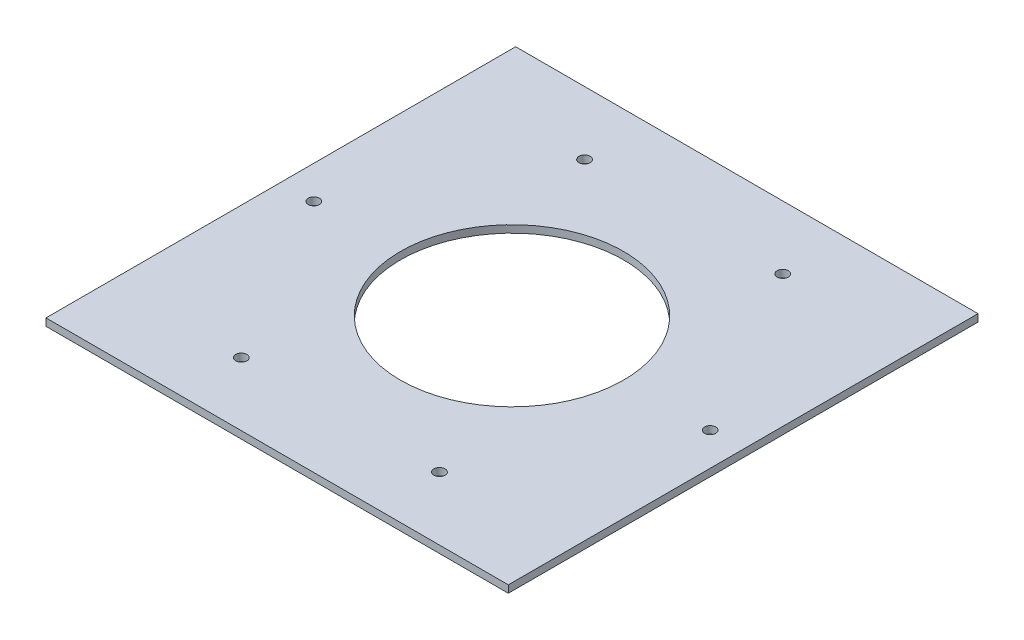
ISO-10303-21;
HEADER;
FILE_DESCRIPTION(('STEP AP214'),'2;1');
FILE_NAME('part.step','',(''),(''),'','','');
FILE_SCHEMA(('AUTOMOTIVE_DESIGN { 1 0 10303 214 1 1 1 1 }'));
ENDSEC;
DATA;
#1=APPLICATION_CONTEXT('core data for automotive mechanical design processes');
#2=APPLICATION_PROTOCOL_DEFINITION('international standard','automotive_design',2000,#1);
#3=PRODUCT_CONTEXT('',#1,'mechanical');
#4=PRODUCT('Part','Part','',(#3));
#5=PRODUCT_RELATED_PRODUCT_CATEGORY('part','',(#4));
#6=PRODUCT_DEFINITION_FORMATION('','',#4);
#7=PRODUCT_DEFINITION_CONTEXT('part definition',#1,'design');
#8=PRODUCT_DEFINITION('design','',#6,#7);
#9=PRODUCT_DEFINITION_SHAPE('','',#8);
#10=(LENGTH_UNIT() NAMED_UNIT(*) SI_UNIT(.MILLI.,.METRE.));
#11=(NAMED_UNIT(*) PLANE_ANGLE_UNIT() SI_UNIT($,.RADIAN.));
#12=(NAMED_UNIT(*) SI_UNIT($,.STERADIAN.) SOLID_ANGLE_UNIT());
#13=UNCERTAINTY_MEASURE_WITH_UNIT(LENGTH_MEASURE(1.E-05),#10,'distance_accuracy_value','');
#14=(GEOMETRIC_REPRESENTATION_CONTEXT(3) GLOBAL_UNCERTAINTY_ASSIGNED_CONTEXT((#13)) GLOBAL_UNIT_ASSIGNED_CONTEXT((#10,
#11,#12)) REPRESENTATION_CONTEXT('',''));
#15=CARTESIAN_POINT('',(0.,0.,0.));
#16=DIRECTION('',(0.,0.,1.));
#17=DIRECTION('',(1.,0.,0.));
#18=AXIS2_PLACEMENT_3D('',#15,#16,#17);
#19=CARTESIAN_POINT('',(0.,3.175,0.));
#20=DIRECTION('',(0.,1.,0.));
#21=DIRECTION('',(0.,0.,1.));
#22=AXIS2_PLACEMENT_3D('',#19,#20,#21);
#23=PLANE('',#22);
#24=CARTESIAN_POINT('',(0.,3.175,0.));
#25=DIRECTION('',(0.,1.,0.));
#26=DIRECTION('',(0.,0.,1.));
#27=AXIS2_PLACEMENT_3D('',#24,#25,#26);
#28=CIRCLE('',#27,48.26);
#29=CARTESIAN_POINT('',(0.,3.175,48.26));
#30=VERTEX_POINT('',#29);
#31=EDGE_CURVE('E151',#30,#30,#28,.T.);
#32=ORIENTED_EDGE('',*,*,#31,.F.);
#33=EDGE_LOOP('',(#32));
#34=FACE_BOUND('',#33,.T.);
#35=CARTESIAN_POINT('',(-85.725,3.175,-5.41233724504764E-13));
#36=DIRECTION('',(0.,1.,0.));
#37=DIRECTION('',(0.,0.,1.));
#38=AXIS2_PLACEMENT_3D('',#35,#36,#37);
#39=CIRCLE('',#38,2.41299999999999);
#40=CARTESIAN_POINT('',(-85.725,3.175,2.41299999999945));
#41=VERTEX_POINT('',#40);
#42=EDGE_CURVE('E136',#41,#41,#39,.T.);
#43=ORIENTED_EDGE('',*,*,#42,.F.);
#44=EDGE_LOOP('',(#43));
#45=FACE_BOUND('',#44,.T.);
#46=CARTESIAN_POINT('',(42.8624999999999,3.175,74.2400277394211));
#47=DIRECTION('',(0.,1.,0.));
#48=DIRECTION('',(0.,0.,1.));
#49=AXIS2_PLACEMENT_3D('',#46,#47,#48);
#50=CIRCLE('',#49,2.41299999999999);
#51=CARTESIAN_POINT('',(42.8624999999999,3.175,76.6530277394211));
#52=VERTEX_POINT('',#51);
#53=EDGE_CURVE('E124',#52,#52,#50,.T.);
#54=ORIENTED_EDGE('',*,*,#53,.F.);
#55=EDGE_LOOP('',(#54));
#56=FACE_BOUND('',#55,.T.);
#57=CARTESIAN_POINT('',(42.8624999999998,3.175,-74.2400277394211));
#58=DIRECTION('',(0.,1.,0.));
#59=DIRECTION('',(0.,0.,1.));
#60=AXIS2_PLACEMENT_3D('',#57,#58,#59);
#61=CIRCLE('',#60,2.41299999999999);
#62=CARTESIAN_POINT('',(42.8624999999998,3.175,-71.8270277394211));
#63=VERTEX_POINT('',#62);
#64=EDGE_CURVE('E103',#63,#63,#61,.T.);
#65=ORIENTED_EDGE('',*,*,#64,.F.);
#66=EDGE_LOOP('',(#65));
#67=FACE_BOUND('',#66,.T.);
#68=DIRECTION('',(0.,0.,-1.));
#69=VECTOR('',#68,1.);
#70=CARTESIAN_POINT('',(100.0125,3.175,-101.6));
#71=LINE('',#70,#69);
#72=CARTESIAN_POINT('',(100.0125,3.175,101.6));
#73=VERTEX_POINT('',#72);
#74=CARTESIAN_POINT('',(100.0125,3.175,-101.6));
#75=VERTEX_POINT('',#74);
#76=EDGE_CURVE('E88',#73,#75,#71,.T.);
#77=ORIENTED_EDGE('',*,*,#76,.T.);
#78=DIRECTION('',(-1.,0.,0.));
#79=VECTOR('',#78,1.);
#80=CARTESIAN_POINT('',(-100.0125,3.175,-101.6));
#81=LINE('',#80,#79);
#82=CARTESIAN_POINT('',(-100.0125,3.175,-101.6));
#83=VERTEX_POINT('',#82);
#84=EDGE_CURVE('E83',#75,#83,#81,.T.);
#85=ORIENTED_EDGE('',*,*,#84,.T.);
#86=DIRECTION('',(0.,0.,1.));
#87=VECTOR('',#86,1.);
#88=CARTESIAN_POINT('',(-100.0125,3.175,-101.6));
#89=LINE('',#88,#87);
#90=CARTESIAN_POINT('',(-100.0125,3.175,101.6));
#91=VERTEX_POINT('',#90);
#92=EDGE_CURVE('E86',#83,#91,#89,.T.);
#93=ORIENTED_EDGE('',*,*,#92,.T.);
#94=DIRECTION('',(1.,0.,0.));
#95=VECTOR('',#94,1.);
#96=CARTESIAN_POINT('',(-100.0125,3.175,101.6));
#97=LINE('',#96,#95);
#98=EDGE_CURVE('E53',#91,#73,#97,.T.);
#99=ORIENTED_EDGE('',*,*,#98,.T.);
#100=EDGE_LOOP('',(#77,#85,#93,#99));
#101=FACE_BOUND('',#100,.T.);
#102=CARTESIAN_POINT('',(85.725,3.175,0.));
#103=DIRECTION('',(0.,1.,0.));
#104=DIRECTION('',(0.,0.,1.));
#105=AXIS2_PLACEMENT_3D('',#102,#103,#104);
#106=CIRCLE('',#105,2.413);
#107=CARTESIAN_POINT('',(85.725,3.175,2.41299999999997));
#108=VERTEX_POINT('',#107);
#109=EDGE_CURVE('E118',#108,#108,#106,.T.);
#110=ORIENTED_EDGE('',*,*,#109,.F.);
#111=EDGE_LOOP('',(#110));
#112=FACE_BOUND('',#111,.T.);
#113=CARTESIAN_POINT('',(-42.8625000000003,3.175,74.2400277394208));
#114=DIRECTION('',(0.,1.,0.));
#115=DIRECTION('',(0.,0.,1.));
#116=AXIS2_PLACEMENT_3D('',#113,#114,#115);
#117=CIRCLE('',#116,2.41299999999999);
#118=CARTESIAN_POINT('',(-42.8625000000003,3.175,76.6530277394208));
#119=VERTEX_POINT('',#118);
#120=EDGE_CURVE('E130',#119,#119,#117,.T.);
#121=ORIENTED_EDGE('',*,*,#120,.F.);
#122=EDGE_LOOP('',(#121));
#123=FACE_BOUND('',#122,.T.);
#124=CARTESIAN_POINT('',(-42.8624999999993,3.175,-74.2400277394214));
#125=DIRECTION('',(0.,1.,0.));
#126=DIRECTION('',(0.,0.,1.));
#127=AXIS2_PLACEMENT_3D('',#124,#125,#126);
#128=CIRCLE('',#127,2.41299999999998);
#129=CARTESIAN_POINT('',(-42.8624999999993,3.175,-71.8270277394214));
#130=VERTEX_POINT('',#129);
#131=EDGE_CURVE('E142',#130,#130,#128,.T.);
#132=ORIENTED_EDGE('',*,*,#131,.F.);
#133=EDGE_LOOP('',(#132));
#134=FACE_BOUND('',#133,.T.);
#135=ADVANCED_FACE('F36',(#34,#45,#56,#67,#101,#112,#123,#134),#23,.T.);
#136=CARTESIAN_POINT('',(0.,0.,0.));
#137=DIRECTION('',(0.,1.,0.));
#138=DIRECTION('',(0.,0.,1.));
#139=AXIS2_PLACEMENT_3D('',#136,#137,#138);
#140=PLANE('',#139);
#141=CARTESIAN_POINT('',(0.,0.,0.));
#142=DIRECTION('',(0.,1.,0.));
#143=DIRECTION('',(0.,0.,1.));
#144=AXIS2_PLACEMENT_3D('',#141,#142,#143);
#145=CIRCLE('',#144,48.26);
#146=CARTESIAN_POINT('',(0.,0.,48.26));
#147=VERTEX_POINT('',#146);
#148=EDGE_CURVE('E148',#147,#147,#145,.T.);
#149=ORIENTED_EDGE('',*,*,#148,.T.);
#150=EDGE_LOOP('',(#149));
#151=FACE_BOUND('',#150,.T.);
#152=DIRECTION('',(0.,0.,-1.));
#153=VECTOR('',#152,1.);
#154=CARTESIAN_POINT('',(100.0125,0.,-101.6));
#155=LINE('',#154,#153);
#156=CARTESIAN_POINT('',(100.0125,0.,101.6));
#157=VERTEX_POINT('',#156);
#158=CARTESIAN_POINT('',(100.0125,0.,-101.6));
#159=VERTEX_POINT('',#158);
#160=EDGE_CURVE('E100',#157,#159,#155,.T.);
#161=ORIENTED_EDGE('',*,*,#160,.F.);
#162=DIRECTION('',(1.,0.,0.));
#163=VECTOR('',#162,1.);
#164=CARTESIAN_POINT('',(-100.0125,0.,101.6));
#165=LINE('',#164,#163);
#166=CARTESIAN_POINT('',(-100.0125,0.,101.6));
#167=VERTEX_POINT('',#166);
#168=EDGE_CURVE('E76',#167,#157,#165,.T.);
#169=ORIENTED_EDGE('',*,*,#168,.F.);
#170=DIRECTION('',(0.,0.,1.));
#171=VECTOR('',#170,1.);
#172=CARTESIAN_POINT('',(-100.0125,0.,-101.6));
#173=LINE('',#172,#171);
#174=CARTESIAN_POINT('',(-100.0125,0.,-101.6));
#175=VERTEX_POINT('',#174);
#176=EDGE_CURVE('E70',#175,#167,#173,.T.);
#177=ORIENTED_EDGE('',*,*,#176,.F.);
#178=DIRECTION('',(-1.,0.,0.));
#179=VECTOR('',#178,1.);
#180=CARTESIAN_POINT('',(-100.0125,0.,-101.6));
#181=LINE('',#180,#179);
#182=EDGE_CURVE('E92',#159,#175,#181,.T.);
#183=ORIENTED_EDGE('',*,*,#182,.F.);
#184=EDGE_LOOP('',(#161,#169,#177,#183));
#185=FACE_BOUND('',#184,.T.);
#186=CARTESIAN_POINT('',(42.8624999999998,0.,-74.2400277394211));
#187=DIRECTION('',(0.,1.,0.));
#188=DIRECTION('',(0.,0.,1.));
#189=AXIS2_PLACEMENT_3D('',#186,#187,#188);
#190=CIRCLE('',#189,2.41299999999999);
#191=CARTESIAN_POINT('',(42.8624999999998,0.,-71.8270277394211));
#192=VERTEX_POINT('',#191);
#193=EDGE_CURVE('E115',#192,#192,#190,.T.);
#194=ORIENTED_EDGE('',*,*,#193,.T.);
#195=EDGE_LOOP('',(#194));
#196=FACE_BOUND('',#195,.T.);
#197=CARTESIAN_POINT('',(85.725,0.,0.));
#198=DIRECTION('',(0.,1.,0.));
#199=DIRECTION('',(0.,0.,1.));
#200=AXIS2_PLACEMENT_3D('',#197,#198,#199);
#201=CIRCLE('',#200,2.413);
#202=CARTESIAN_POINT('',(85.725,0.,2.41299999999997));
#203=VERTEX_POINT('',#202);
#204=EDGE_CURVE('E121',#203,#203,#201,.T.);
#205=ORIENTED_EDGE('',*,*,#204,.T.);
#206=EDGE_LOOP('',(#205));
#207=FACE_BOUND('',#206,.T.);
#208=CARTESIAN_POINT('',(42.8624999999999,0.,74.2400277394211));
#209=DIRECTION('',(0.,1.,0.));
#210=DIRECTION('',(0.,0.,1.));
#211=AXIS2_PLACEMENT_3D('',#208,#209,#210);
#212=CIRCLE('',#211,2.41299999999999);
#213=CARTESIAN_POINT('',(42.8624999999999,0.,76.6530277394211));
#214=VERTEX_POINT('',#213);
#215=EDGE_CURVE('E127',#214,#214,#212,.T.);
#216=ORIENTED_EDGE('',*,*,#215,.T.);
#217=EDGE_LOOP('',(#216));
#218=FACE_BOUND('',#217,.T.);
#219=CARTESIAN_POINT('',(-42.8625000000003,0.,74.2400277394208));
#220=DIRECTION('',(0.,1.,0.));
#221=DIRECTION('',(0.,0.,1.));
#222=AXIS2_PLACEMENT_3D('',#219,#220,#221);
#223=CIRCLE('',#222,2.41299999999999);
#224=CARTESIAN_POINT('',(-42.8625000000003,0.,76.6530277394208));
#225=VERTEX_POINT('',#224);
#226=EDGE_CURVE('E133',#225,#225,#223,.T.);
#227=ORIENTED_EDGE('',*,*,#226,.T.);
#228=EDGE_LOOP('',(#227));
#229=FACE_BOUND('',#228,.T.);
#230=CARTESIAN_POINT('',(-85.725,0.,-5.41233724504764E-13));
#231=DIRECTION('',(0.,1.,0.));
#232=DIRECTION('',(0.,0.,1.));
#233=AXIS2_PLACEMENT_3D('',#230,#231,#232);
#234=CIRCLE('',#233,2.41299999999999);
#235=CARTESIAN_POINT('',(-85.725,0.,2.41299999999945));
#236=VERTEX_POINT('',#235);
#237=EDGE_CURVE('E139',#236,#236,#234,.T.);
#238=ORIENTED_EDGE('',*,*,#237,.T.);
#239=EDGE_LOOP('',(#238));
#240=FACE_BOUND('',#239,.T.);
#241=CARTESIAN_POINT('',(-42.8624999999993,0.,-74.2400277394214));
#242=DIRECTION('',(0.,1.,0.));
#243=DIRECTION('',(0.,0.,1.));
#244=AXIS2_PLACEMENT_3D('',#241,#242,#243);
#245=CIRCLE('',#244,2.41299999999998);
#246=CARTESIAN_POINT('',(-42.8624999999993,0.,-71.8270277394214));
#247=VERTEX_POINT('',#246);
#248=EDGE_CURVE('E145',#247,#247,#245,.T.);
#249=ORIENTED_EDGE('',*,*,#248,.T.);
#250=EDGE_LOOP('',(#249));
#251=FACE_BOUND('',#250,.T.);
#252=ADVANCED_FACE('F111',(#151,#185,#196,#207,#218,#229,#240,#251),#140,.F.);
#253=CARTESIAN_POINT('',(100.0125,3.175,-101.6));
#254=DIRECTION('',(-1.,0.,0.));
#255=DIRECTION('',(0.,0.,1.));
#256=AXIS2_PLACEMENT_3D('',#253,#254,#255);
#257=PLANE('',#256);
#258=ORIENTED_EDGE('',*,*,#160,.T.);
#259=DIRECTION('',(0.,-1.,0.));
#260=VECTOR('',#259,1.);
#261=CARTESIAN_POINT('',(100.0125,3.175,-101.6));
#262=LINE('',#261,#260);
#263=EDGE_CURVE('E11',#75,#159,#262,.T.);
#264=ORIENTED_EDGE('',*,*,#263,.F.);
#265=ORIENTED_EDGE('',*,*,#76,.F.);
#266=DIRECTION('',(0.,-1.,0.));
#267=VECTOR('',#266,1.);
#268=CARTESIAN_POINT('',(100.0125,3.175,101.6));
#269=LINE('',#268,#267);
#270=EDGE_CURVE('E96',#73,#157,#269,.T.);
#271=ORIENTED_EDGE('',*,*,#270,.T.);
#272=EDGE_LOOP('',(#258,#264,#265,#271));
#273=FACE_BOUND('',#272,.T.);
#274=ADVANCED_FACE('F38',(#273),#257,.F.);
#275=CARTESIAN_POINT('',(-100.0125,3.175,-101.6));
#276=DIRECTION('',(0.,0.,1.));
#277=DIRECTION('',(1.,0.,0.));
#278=AXIS2_PLACEMENT_3D('',#275,#276,#277);
#279=PLANE('',#278);
#280=ORIENTED_EDGE('',*,*,#182,.T.);
#281=DIRECTION('',(0.,-1.,0.));
#282=VECTOR('',#281,1.);
#283=CARTESIAN_POINT('',(-100.0125,3.175,-101.6));
#284=LINE('',#283,#282);
#285=EDGE_CURVE('E45',#83,#175,#284,.T.);
#286=ORIENTED_EDGE('',*,*,#285,.F.);
#287=ORIENTED_EDGE('',*,*,#84,.F.);
#288=ORIENTED_EDGE('',*,*,#263,.T.);
#289=EDGE_LOOP('',(#280,#286,#287,#288));
#290=FACE_BOUND('',#289,.T.);
#291=ADVANCED_FACE('F91',(#290),#279,.F.);
#292=CARTESIAN_POINT('',(-100.0125,3.175,-101.6));
#293=DIRECTION('',(1.,0.,0.));
#294=DIRECTION('',(0.,0.,-1.));
#295=AXIS2_PLACEMENT_3D('',#292,#293,#294);
#296=PLANE('',#295);
#297=ORIENTED_EDGE('',*,*,#176,.T.);
#298=DIRECTION('',(0.,-1.,0.));
#299=VECTOR('',#298,1.);
#300=CARTESIAN_POINT('',(-100.0125,3.175,101.6));
#301=LINE('',#300,#299);
#302=EDGE_CURVE('E93',#91,#167,#301,.T.);
#303=ORIENTED_EDGE('',*,*,#302,.F.);
#304=ORIENTED_EDGE('',*,*,#92,.F.);
#305=ORIENTED_EDGE('',*,*,#285,.T.);
#306=EDGE_LOOP('',(#297,#303,#304,#305));
#307=FACE_BOUND('',#306,.T.);
#308=ADVANCED_FACE('F94',(#307),#296,.F.);
#309=CARTESIAN_POINT('',(-100.0125,3.175,101.6));
#310=DIRECTION('',(0.,0.,-1.));
#311=DIRECTION('',(-1.,0.,0.));
#312=AXIS2_PLACEMENT_3D('',#309,#310,#311);
#313=PLANE('',#312);
#314=ORIENTED_EDGE('',*,*,#168,.T.);
#315=ORIENTED_EDGE('',*,*,#270,.F.);
#316=ORIENTED_EDGE('',*,*,#98,.F.);
#317=ORIENTED_EDGE('',*,*,#302,.T.);
#318=EDGE_LOOP('',(#314,#315,#316,#317));
#319=FACE_BOUND('',#318,.T.);
#320=ADVANCED_FACE('F108',(#319),#313,.F.);
#321=CARTESIAN_POINT('',(42.8624999999998,3.175,-74.2400277394211));
#322=DIRECTION('',(0.,-1.,0.));
#323=DIRECTION('',(0.,0.,-1.));
#324=AXIS2_PLACEMENT_3D('',#321,#322,#323);
#325=CYLINDRICAL_SURFACE('',#324,2.41299999999999);
#326=ORIENTED_EDGE('',*,*,#64,.T.);
#327=EDGE_LOOP('',(#326));
#328=FACE_BOUND('',#327,.T.);
#329=ORIENTED_EDGE('',*,*,#193,.F.);
#330=EDGE_LOOP('',(#329));
#331=FACE_BOUND('',#330,.T.);
#332=ADVANCED_FACE('F174',(#328,#331),#325,.F.);
#333=CARTESIAN_POINT('',(85.725,3.175,0.));
#334=DIRECTION('',(0.,-1.,0.));
#335=DIRECTION('',(0.,0.,-1.));
#336=AXIS2_PLACEMENT_3D('',#333,#334,#335);
#337=CYLINDRICAL_SURFACE('',#336,2.413);
#338=ORIENTED_EDGE('',*,*,#109,.T.);
#339=EDGE_LOOP('',(#338));
#340=FACE_BOUND('',#339,.T.);
#341=ORIENTED_EDGE('',*,*,#204,.F.);
#342=EDGE_LOOP('',(#341));
#343=FACE_BOUND('',#342,.T.);
#344=ADVANCED_FACE('F177',(#340,#343),#337,.F.);
#345=CARTESIAN_POINT('',(42.8624999999999,3.175,74.2400277394211));
#346=DIRECTION('',(0.,-1.,0.));
#347=DIRECTION('',(0.,0.,-1.));
#348=AXIS2_PLACEMENT_3D('',#345,#346,#347);
#349=CYLINDRICAL_SURFACE('',#348,2.41299999999999);
#350=ORIENTED_EDGE('',*,*,#53,.T.);
#351=EDGE_LOOP('',(#350));
#352=FACE_BOUND('',#351,.T.);
#353=ORIENTED_EDGE('',*,*,#215,.F.);
#354=EDGE_LOOP('',(#353));
#355=FACE_BOUND('',#354,.T.);
#356=ADVANCED_FACE('F206',(#352,#355),#349,.F.);
#357=CARTESIAN_POINT('',(-42.8625000000003,3.175,74.2400277394208));
#358=DIRECTION('',(0.,-1.,0.));
#359=DIRECTION('',(0.,0.,-1.));
#360=AXIS2_PLACEMENT_3D('',#357,#358,#359);
#361=CYLINDRICAL_SURFACE('',#360,2.41299999999999);
#362=ORIENTED_EDGE('',*,*,#120,.T.);
#363=EDGE_LOOP('',(#362));
#364=FACE_BOUND('',#363,.T.);
#365=ORIENTED_EDGE('',*,*,#226,.F.);
#366=EDGE_LOOP('',(#365));
#367=FACE_BOUND('',#366,.T.);
#368=ADVANCED_FACE('F200',(#364,#367),#361,.F.);
#369=CARTESIAN_POINT('',(-85.725,3.175,-5.41233724504764E-13));
#370=DIRECTION('',(0.,-1.,0.));
#371=DIRECTION('',(0.,0.,-1.));
#372=AXIS2_PLACEMENT_3D('',#369,#370,#371);
#373=CYLINDRICAL_SURFACE('',#372,2.41299999999999);
#374=ORIENTED_EDGE('',*,*,#42,.T.);
#375=EDGE_LOOP('',(#374));
#376=FACE_BOUND('',#375,.T.);
#377=ORIENTED_EDGE('',*,*,#237,.F.);
#378=EDGE_LOOP('',(#377));
#379=FACE_BOUND('',#378,.T.);
#380=ADVANCED_FACE('F194',(#376,#379),#373,.F.);
#381=CARTESIAN_POINT('',(-42.8624999999993,3.175,-74.2400277394214));
#382=DIRECTION('',(0.,-1.,0.));
#383=DIRECTION('',(0.,0.,-1.));
#384=AXIS2_PLACEMENT_3D('',#381,#382,#383);
#385=CYLINDRICAL_SURFACE('',#384,2.41299999999998);
#386=ORIENTED_EDGE('',*,*,#131,.T.);
#387=EDGE_LOOP('',(#386));
#388=FACE_BOUND('',#387,.T.);
#389=ORIENTED_EDGE('',*,*,#248,.F.);
#390=EDGE_LOOP('',(#389));
#391=FACE_BOUND('',#390,.T.);
#392=ADVANCED_FACE('F161',(#388,#391),#385,.F.);
#393=CARTESIAN_POINT('',(0.,0.,0.));
#394=DIRECTION('',(0.,1.,0.));
#395=DIRECTION('',(0.,0.,1.));
#396=AXIS2_PLACEMENT_3D('',#393,#394,#395);
#397=CYLINDRICAL_SURFACE('',#396,48.26);
#398=ORIENTED_EDGE('',*,*,#148,.F.);
#399=EDGE_LOOP('',(#398));
#400=FACE_BOUND('',#399,.T.);
#401=ORIENTED_EDGE('',*,*,#31,.T.);
#402=EDGE_LOOP('',(#401));
#403=FACE_BOUND('',#402,.T.);
#404=ADVANCED_FACE('F158',(#400,#403),#397,.F.);
#405=CLOSED_SHELL('',(#135,#252,#274,#291,#308,#320,#332,#344,#356,#368,#380,#392,#404));
#406=MANIFOLD_SOLID_BREP('B2',#405);
#407=ADVANCED_BREP_SHAPE_REPRESENTATION('',(#18,#406),#14);
#408=SHAPE_DEFINITION_REPRESENTATION(#9,#407);
ENDSEC;
END-ISO-10303-21;
